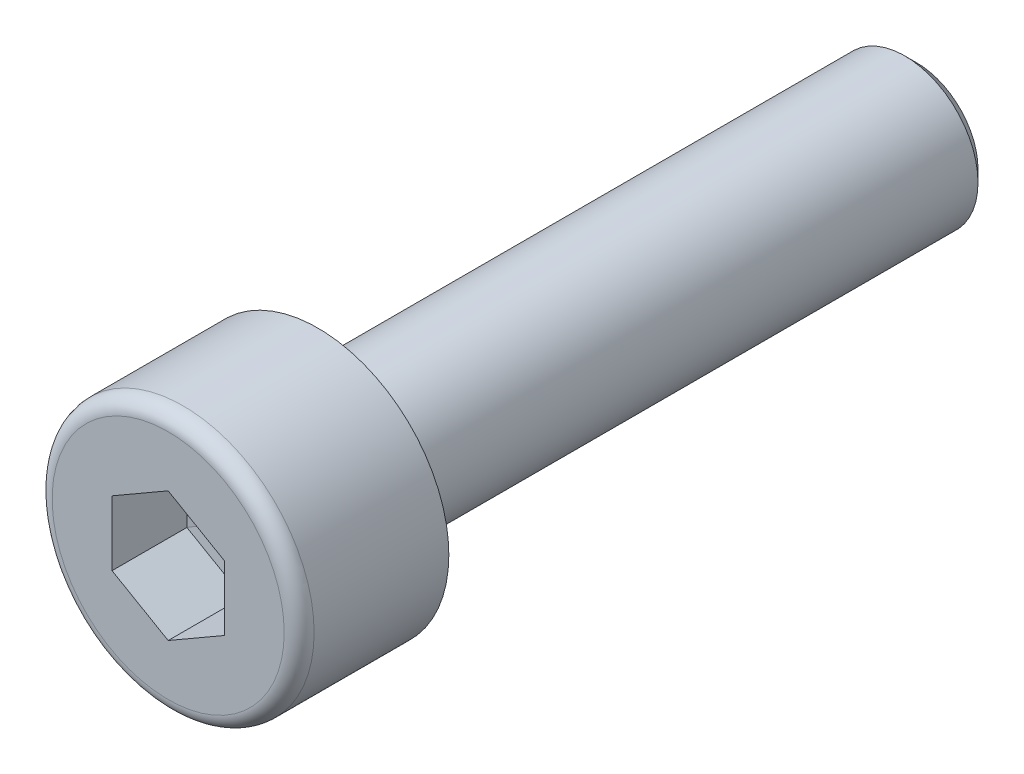
ISO-10303-21;
HEADER;
FILE_DESCRIPTION(('STEP AP214'),'2;1');
FILE_NAME('part.step','',(''),(''),'','','');
FILE_SCHEMA(('AUTOMOTIVE_DESIGN { 1 0 10303 214 1 1 1 1 }'));
ENDSEC;
DATA;
#1=APPLICATION_CONTEXT('core data for automotive mechanical design processes');
#2=APPLICATION_PROTOCOL_DEFINITION('international standard','automotive_design',2000,#1);
#3=PRODUCT_CONTEXT('',#1,'mechanical');
#4=PRODUCT('Part','Part','',(#3));
#5=PRODUCT_RELATED_PRODUCT_CATEGORY('part','',(#4));
#6=PRODUCT_DEFINITION_FORMATION('','',#4);
#7=PRODUCT_DEFINITION_CONTEXT('part definition',#1,'design');
#8=PRODUCT_DEFINITION('design','',#6,#7);
#9=PRODUCT_DEFINITION_SHAPE('','',#8);
#10=(LENGTH_UNIT() NAMED_UNIT(*) SI_UNIT(.MILLI.,.METRE.));
#11=(NAMED_UNIT(*) PLANE_ANGLE_UNIT() SI_UNIT($,.RADIAN.));
#12=(NAMED_UNIT(*) SI_UNIT($,.STERADIAN.) SOLID_ANGLE_UNIT());
#13=UNCERTAINTY_MEASURE_WITH_UNIT(LENGTH_MEASURE(1.E-05),#10,'distance_accuracy_value','');
#14=(GEOMETRIC_REPRESENTATION_CONTEXT(3) GLOBAL_UNCERTAINTY_ASSIGNED_CONTEXT((#13)) GLOBAL_UNIT_ASSIGNED_CONTEXT((#10,
#11,#12)) REPRESENTATION_CONTEXT('',''));
#15=CARTESIAN_POINT('',(0.,0.,0.));
#16=DIRECTION('',(0.,0.,1.));
#17=DIRECTION('',(1.,0.,0.));
#18=AXIS2_PLACEMENT_3D('',#15,#16,#17);
#19=CARTESIAN_POINT('',(-2.,0.,-5.52772388523122E-13));
#20=DIRECTION('',(0.,0.,-1.));
#21=DIRECTION('',(0.,-1.,0.));
#22=AXIS2_PLACEMENT_3D('',#19,#20,#21);
#23=PLANE('',#22);
#24=CARTESIAN_POINT('',(0.,0.,-5.48450174164827E-13));
#25=DIRECTION('',(0.,0.,-1.));
#26=DIRECTION('',(-1.,0.,0.));
#27=AXIS2_PLACEMENT_3D('',#24,#25,#26);
#28=CIRCLE('',#27,1.954);
#29=CARTESIAN_POINT('',(1.954,0.,-5.4354118545641E-13));
#30=VERTEX_POINT('',#29);
#31=EDGE_CURVE('E11',#30,#30,#28,.T.);
#32=ORIENTED_EDGE('',*,*,#31,.F.);
#33=EDGE_LOOP('',(#32));
#34=FACE_BOUND('',#33,.T.);
#35=CARTESIAN_POINT('',(0.,0.,-9.59435996912573E-13));
#36=DIRECTION('',(0.,0.,-1.));
#37=DIRECTION('',(1.,0.,0.));
#38=AXIS2_PLACEMENT_3D('',#35,#36,#37);
#39=CIRCLE('',#38,3.5);
#40=CARTESIAN_POINT('',(3.5,0.,-9.51183576347603E-13));
#41=VERTEX_POINT('',#40);
#42=EDGE_CURVE('E169',#41,#41,#39,.T.);
#43=ORIENTED_EDGE('',*,*,#42,.T.);
#44=EDGE_LOOP('',(#43));
#45=FACE_BOUND('',#44,.T.);
#46=ADVANCED_FACE('F17',(#34,#45),#23,.T.);
#47=CARTESIAN_POINT('',(0.,0.,-16.));
#48=DIRECTION('',(0.,0.,-1.));
#49=DIRECTION('',(0.,-1.,0.));
#50=AXIS2_PLACEMENT_3D('',#47,#48,#49);
#51=PLANE('',#50);
#52=CARTESIAN_POINT('',(0.,0.,-16.));
#53=DIRECTION('',(0.,0.,-1.));
#54=DIRECTION('',(-1.,0.,0.));
#55=AXIS2_PLACEMENT_3D('',#52,#53,#54);
#56=CIRCLE('',#55,1.640000000004);
#57=CARTESIAN_POINT('',(1.640000000004,0.,-16.));
#58=VERTEX_POINT('',#57);
#59=EDGE_CURVE('E293',#58,#58,#56,.T.);
#60=ORIENTED_EDGE('',*,*,#59,.T.);
#61=EDGE_LOOP('',(#60));
#62=FACE_BOUND('',#61,.T.);
#63=ADVANCED_FACE('F276',(#62),#51,.T.);
#64=CARTESIAN_POINT('',(0.,0.,-8.00000000000027));
#65=DIRECTION('',(0.,0.,-1.));
#66=DIRECTION('',(-1.,0.,0.));
#67=AXIS2_PLACEMENT_3D('',#64,#65,#66);
#68=CYLINDRICAL_SURFACE('',#67,1.954);
#69=CARTESIAN_POINT('',(0.,0.,-15.6860000000043));
#70=DIRECTION('',(0.,0.,1.));
#71=DIRECTION('',(-1.,0.,0.));
#72=AXIS2_PLACEMENT_3D('',#69,#70,#71);
#73=CIRCLE('',#72,1.954);
#74=CARTESIAN_POINT('',(1.95400000000004,0.,-15.6860000000043));
#75=VERTEX_POINT('',#74);
#76=EDGE_CURVE('E303',#75,#75,#73,.T.);
#77=ORIENTED_EDGE('',*,*,#76,.T.);
#78=DIRECTION('',(0.,0.,1.));
#79=VECTOR('',#78,1.);
#80=CARTESIAN_POINT('',(1.954,0.,-8.00000000000027));
#81=LINE('',#80,#79);
#82=EDGE_CURVE('E20',#75,#30,#81,.T.);
#83=ORIENTED_EDGE('',*,*,#82,.T.);
#84=ORIENTED_EDGE('',*,*,#31,.T.);
#85=ORIENTED_EDGE('',*,*,#82,.F.);
#86=EDGE_LOOP('',(#77,#83,#84,#85));
#87=FACE_BOUND('',#86,.T.);
#88=ADVANCED_FACE('F282',(#87),#68,.T.);
#89=CARTESIAN_POINT('',(-1.5,-0.866025403784439,4.));
#90=DIRECTION('',(-1.,0.,0.));
#91=DIRECTION('',(0.,0.,1.));
#92=AXIS2_PLACEMENT_3D('',#89,#90,#91);
#93=PLANE('',#92);
#94=DIRECTION('',(0.,1.,0.));
#95=VECTOR('',#94,1.);
#96=CARTESIAN_POINT('',(-1.5,-0.433012701892219,3.99999999999963));
#97=LINE('',#96,#95);
#98=CARTESIAN_POINT('',(-1.5,-0.866025403784439,4.));
#99=VERTEX_POINT('',#98);
#100=CARTESIAN_POINT('',(-1.5,0.866025403784438,4.));
#101=VERTEX_POINT('',#100);
#102=EDGE_CURVE('E137',#99,#101,#97,.T.);
#103=ORIENTED_EDGE('',*,*,#102,.F.);
#104=DIRECTION('',(0.,0.,-1.));
#105=VECTOR('',#104,1.);
#106=CARTESIAN_POINT('',(-1.5,-0.866025403784439,4.));
#107=LINE('',#106,#105);
#108=CARTESIAN_POINT('',(-1.5,-0.866025403784439,2.));
#109=VERTEX_POINT('',#108);
#110=EDGE_CURVE('E128',#99,#109,#107,.T.);
#111=ORIENTED_EDGE('',*,*,#110,.T.);
#112=DIRECTION('',(0.,1.,0.));
#113=VECTOR('',#112,1.);
#114=CARTESIAN_POINT('',(-1.5,-0.866025403784439,2.));
#115=LINE('',#114,#113);
#116=CARTESIAN_POINT('',(-1.5,0.866025403784438,2.));
#117=VERTEX_POINT('',#116);
#118=EDGE_CURVE('E223',#109,#117,#115,.T.);
#119=ORIENTED_EDGE('',*,*,#118,.T.);
#120=DIRECTION('',(0.,0.,-1.));
#121=VECTOR('',#120,1.);
#122=CARTESIAN_POINT('',(-1.5,0.866025403784438,4.));
#123=LINE('',#122,#121);
#124=EDGE_CURVE('E45',#101,#117,#123,.T.);
#125=ORIENTED_EDGE('',*,*,#124,.F.);
#126=EDGE_LOOP('',(#103,#111,#119,#125));
#127=FACE_BOUND('',#126,.T.);
#128=ADVANCED_FACE('F252',(#127),#93,.F.);
#129=CARTESIAN_POINT('',(0.,-1.73205080756888,4.));
#130=DIRECTION('',(-0.5,-0.866025403784439,0.));
#131=DIRECTION('',(-0.866025403784439,0.5,0.));
#132=AXIS2_PLACEMENT_3D('',#129,#130,#131);
#133=PLANE('',#132);
#134=DIRECTION('',(-0.866025403784439,0.5,0.));
#135=VECTOR('',#134,1.);
#136=CARTESIAN_POINT('',(-1.6875,-0.757772228311384,3.99999999999963));
#137=LINE('',#136,#135);
#138=CARTESIAN_POINT('',(0.,-1.73205080756888,4.));
#139=VERTEX_POINT('',#138);
#140=EDGE_CURVE('E131',#139,#99,#137,.T.);
#141=ORIENTED_EDGE('',*,*,#140,.F.);
#142=DIRECTION('',(0.,0.,-1.));
#143=VECTOR('',#142,1.);
#144=CARTESIAN_POINT('',(0.,-1.73205080756888,4.));
#145=LINE('',#144,#143);
#146=CARTESIAN_POINT('',(0.,-1.73205080756888,2.));
#147=VERTEX_POINT('',#146);
#148=EDGE_CURVE('E116',#139,#147,#145,.T.);
#149=ORIENTED_EDGE('',*,*,#148,.T.);
#150=DIRECTION('',(-0.866025403784439,0.5,0.));
#151=VECTOR('',#150,1.);
#152=CARTESIAN_POINT('',(0.,-1.73205080756888,2.));
#153=LINE('',#152,#151);
#154=EDGE_CURVE('E182',#147,#109,#153,.T.);
#155=ORIENTED_EDGE('',*,*,#154,.T.);
#156=ORIENTED_EDGE('',*,*,#110,.F.);
#157=EDGE_LOOP('',(#141,#149,#155,#156));
#158=FACE_BOUND('',#157,.T.);
#159=ADVANCED_FACE('F132',(#158),#133,.F.);
#160=CARTESIAN_POINT('',(1.5,-0.866025403784439,4.));
#161=DIRECTION('',(0.5,-0.866025403784439,0.));
#162=DIRECTION('',(0.,0.,-1.));
#163=AXIS2_PLACEMENT_3D('',#160,#161,#162);
#164=PLANE('',#163);
#165=DIRECTION('',(-0.866025403784439,-0.5,0.));
#166=VECTOR('',#165,1.);
#167=CARTESIAN_POINT('',(-0.1875,-1.84030398304193,3.99999999999964));
#168=LINE('',#167,#166);
#169=CARTESIAN_POINT('',(1.5,-0.866025403784439,4.));
#170=VERTEX_POINT('',#169);
#171=EDGE_CURVE('E120',#170,#139,#168,.T.);
#172=ORIENTED_EDGE('',*,*,#171,.F.);
#173=DIRECTION('',(0.,0.,-1.));
#174=VECTOR('',#173,1.);
#175=CARTESIAN_POINT('',(1.5,-0.866025403784439,4.));
#176=LINE('',#175,#174);
#177=CARTESIAN_POINT('',(1.5,-0.866025403784439,2.));
#178=VERTEX_POINT('',#177);
#179=EDGE_CURVE('E129',#170,#178,#176,.T.);
#180=ORIENTED_EDGE('',*,*,#179,.T.);
#181=DIRECTION('',(-0.866025403784439,-0.5,0.));
#182=VECTOR('',#181,1.);
#183=CARTESIAN_POINT('',(1.5,-0.866025403784439,2.));
#184=LINE('',#183,#182);
#185=EDGE_CURVE('E123',#178,#147,#184,.T.);
#186=ORIENTED_EDGE('',*,*,#185,.T.);
#187=ORIENTED_EDGE('',*,*,#148,.F.);
#188=EDGE_LOOP('',(#172,#180,#186,#187));
#189=FACE_BOUND('',#188,.T.);
#190=ADVANCED_FACE('F118',(#189),#164,.F.);
#191=CARTESIAN_POINT('',(1.5,0.866025403784439,4.));
#192=DIRECTION('',(1.,0.,0.));
#193=DIRECTION('',(0.,-1.,0.));
#194=AXIS2_PLACEMENT_3D('',#191,#192,#193);
#195=PLANE('',#194);
#196=DIRECTION('',(0.,-1.,0.));
#197=VECTOR('',#196,1.);
#198=CARTESIAN_POINT('',(1.5,0.433012701892219,3.99999999999964));
#199=LINE('',#198,#197);
#200=CARTESIAN_POINT('',(1.5,0.866025403784439,4.));
#201=VERTEX_POINT('',#200);
#202=EDGE_CURVE('E144',#201,#170,#199,.T.);
#203=ORIENTED_EDGE('',*,*,#202,.F.);
#204=DIRECTION('',(0.,0.,-1.));
#205=VECTOR('',#204,1.);
#206=CARTESIAN_POINT('',(1.5,0.866025403784439,4.));
#207=LINE('',#206,#205);
#208=CARTESIAN_POINT('',(1.5,0.866025403784439,2.));
#209=VERTEX_POINT('',#208);
#210=EDGE_CURVE('E200',#201,#209,#207,.T.);
#211=ORIENTED_EDGE('',*,*,#210,.T.);
#212=DIRECTION('',(0.,-1.,0.));
#213=VECTOR('',#212,1.);
#214=CARTESIAN_POINT('',(1.5,0.866025403784439,2.));
#215=LINE('',#214,#213);
#216=EDGE_CURVE('E195',#209,#178,#215,.T.);
#217=ORIENTED_EDGE('',*,*,#216,.T.);
#218=ORIENTED_EDGE('',*,*,#179,.F.);
#219=EDGE_LOOP('',(#203,#211,#217,#218));
#220=FACE_BOUND('',#219,.T.);
#221=ADVANCED_FACE('F236',(#220),#195,.F.);
#222=CARTESIAN_POINT('',(0.,1.73205080756888,4.));
#223=DIRECTION('',(0.5,0.866025403784439,0.));
#224=DIRECTION('',(0.,0.,-1.));
#225=AXIS2_PLACEMENT_3D('',#222,#223,#224);
#226=PLANE('',#225);
#227=DIRECTION('',(0.866025403784439,-0.5,0.));
#228=VECTOR('',#227,1.);
#229=CARTESIAN_POINT('',(-0.9375,2.27331668493415,3.99999999999963));
#230=LINE('',#229,#228);
#231=CARTESIAN_POINT('',(0.,1.73205080756888,4.));
#232=VERTEX_POINT('',#231);
#233=EDGE_CURVE('E151',#232,#201,#230,.T.);
#234=ORIENTED_EDGE('',*,*,#233,.F.);
#235=DIRECTION('',(0.,0.,-1.));
#236=VECTOR('',#235,1.);
#237=CARTESIAN_POINT('',(0.,1.73205080756888,4.));
#238=LINE('',#237,#236);
#239=CARTESIAN_POINT('',(0.,1.73205080756888,2.));
#240=VERTEX_POINT('',#239);
#241=EDGE_CURVE('E203',#232,#240,#238,.T.);
#242=ORIENTED_EDGE('',*,*,#241,.T.);
#243=DIRECTION('',(0.866025403784439,-0.5,0.));
#244=VECTOR('',#243,1.);
#245=CARTESIAN_POINT('',(0.,1.73205080756888,2.));
#246=LINE('',#245,#244);
#247=EDGE_CURVE('E207',#240,#209,#246,.T.);
#248=ORIENTED_EDGE('',*,*,#247,.T.);
#249=ORIENTED_EDGE('',*,*,#210,.F.);
#250=EDGE_LOOP('',(#234,#242,#248,#249));
#251=FACE_BOUND('',#250,.T.);
#252=ADVANCED_FACE('F257',(#251),#226,.F.);
#253=CARTESIAN_POINT('',(-1.5,0.86602540378444,4.));
#254=DIRECTION('',(-0.5,0.866025403784439,0.));
#255=DIRECTION('',(0.,0.,1.));
#256=AXIS2_PLACEMENT_3D('',#253,#254,#255);
#257=PLANE('',#256);
#258=DIRECTION('',(0.866025403784439,0.5,0.));
#259=VECTOR('',#258,1.);
#260=CARTESIAN_POINT('',(-2.4375,0.324759526419167,3.99999999999963));
#261=LINE('',#260,#259);
#262=EDGE_CURVE('E164',#101,#232,#261,.T.);
#263=ORIENTED_EDGE('',*,*,#262,.F.);
#264=ORIENTED_EDGE('',*,*,#124,.T.);
#265=DIRECTION('',(0.866025403784439,0.5,0.));
#266=VECTOR('',#265,1.);
#267=CARTESIAN_POINT('',(-1.5,0.86602540378444,2.));
#268=LINE('',#267,#266);
#269=EDGE_CURVE('E215',#117,#240,#268,.T.);
#270=ORIENTED_EDGE('',*,*,#269,.T.);
#271=ORIENTED_EDGE('',*,*,#241,.F.);
#272=EDGE_LOOP('',(#263,#264,#270,#271));
#273=FACE_BOUND('',#272,.T.);
#274=ADVANCED_FACE('F253',(#273),#257,.F.);
#275=CARTESIAN_POINT('',(-1.5,0.866025403784438,2.));
#276=DIRECTION('',(-0.0871557427476581,0.,-0.996194698091746));
#277=DIRECTION('',(-0.996194698091746,0.,0.0871557427476581));
#278=AXIS2_PLACEMENT_3D('',#275,#276,#277);
#279=PLANE('',#278);
#280=DIRECTION('',(0.863550259614423,-0.498570974847159,-0.0755508581011305));
#281=VECTOR('',#280,1.);
#282=CARTESIAN_POINT('',(-1.12714047455993,0.6507548564017,1.96737901843634));
#283=LINE('',#282,#281);
#284=CARTESIAN_POINT('',(0.,0.,1.86876700471111));
#285=VERTEX_POINT('',#284);
#286=EDGE_CURVE('E220',#117,#285,#283,.T.);
#287=ORIENTED_EDGE('',*,*,#286,.F.);
#288=ORIENTED_EDGE('',*,*,#118,.F.);
#289=DIRECTION('',(0.863550259614423,0.498570974847158,-0.0755508581011305));
#290=VECTOR('',#289,1.);
#291=CARTESIAN_POINT('',(-1.12714047455993,-0.6507548564017,1.96737901843634));
#292=LINE('',#291,#290);
#293=EDGE_CURVE('E178',#109,#285,#292,.T.);
#294=ORIENTED_EDGE('',*,*,#293,.T.);
#295=EDGE_LOOP('',(#287,#288,#294));
#296=FACE_BOUND('',#295,.T.);
#297=ADVANCED_FACE('F249',(#296),#279,.F.);
#298=CARTESIAN_POINT('',(0.,1.73205080756888,2.));
#299=DIRECTION('',(-0.043577871373829,0.0754790873051733,-0.996194698091746));
#300=DIRECTION('',(-0.999044587684655,0.,0.043702537889669));
#301=AXIS2_PLACEMENT_3D('',#298,#299,#300);
#302=PLANE('',#301);
#303=DIRECTION('',(0.,-0.997141949694317,-0.0755508581011306));
#304=VECTOR('',#303,1.);
#305=CARTESIAN_POINT('',(0.,1.3015097128034,1.96737901843634));
#306=LINE('',#305,#304);
#307=EDGE_CURVE('E211',#240,#285,#306,.T.);
#308=ORIENTED_EDGE('',*,*,#307,.F.);
#309=ORIENTED_EDGE('',*,*,#269,.F.);
#310=ORIENTED_EDGE('',*,*,#286,.T.);
#311=EDGE_LOOP('',(#308,#309,#310));
#312=FACE_BOUND('',#311,.T.);
#313=ADVANCED_FACE('F262',(#312),#302,.F.);
#314=CARTESIAN_POINT('',(1.5,0.866025403784439,2.));
#315=DIRECTION('',(0.0435778713738291,0.0754790873051733,-0.996194698091746));
#316=DIRECTION('',(-0.999044587684655,0.,-0.0437025378896691));
#317=AXIS2_PLACEMENT_3D('',#314,#315,#316);
#318=PLANE('',#317);
#319=DIRECTION('',(-0.863550259614423,-0.498570974847158,-0.0755508581011305));
#320=VECTOR('',#319,1.);
#321=CARTESIAN_POINT('',(1.12714047455993,0.650754856401705,1.96737901843634));
#322=LINE('',#321,#320);
#323=EDGE_CURVE('E199',#209,#285,#322,.T.);
#324=ORIENTED_EDGE('',*,*,#323,.F.);
#325=ORIENTED_EDGE('',*,*,#247,.F.);
#326=ORIENTED_EDGE('',*,*,#307,.T.);
#327=EDGE_LOOP('',(#324,#325,#326));
#328=FACE_BOUND('',#327,.T.);
#329=ADVANCED_FACE('F260',(#328),#318,.F.);
#330=CARTESIAN_POINT('',(1.5,-0.866025403784439,2.));
#331=DIRECTION('',(0.0871557427476581,0.,-0.996194698091746));
#332=DIRECTION('',(0.,-1.,0.));
#333=AXIS2_PLACEMENT_3D('',#330,#331,#332);
#334=PLANE('',#333);
#335=DIRECTION('',(-0.863550259614423,0.498570974847158,-0.0755508581011305));
#336=VECTOR('',#335,1.);
#337=CARTESIAN_POINT('',(1.12714047455993,-0.650754856401705,1.96737901843634));
#338=LINE('',#337,#336);
#339=EDGE_CURVE('E191',#178,#285,#338,.T.);
#340=ORIENTED_EDGE('',*,*,#339,.F.);
#341=ORIENTED_EDGE('',*,*,#216,.F.);
#342=ORIENTED_EDGE('',*,*,#323,.T.);
#343=EDGE_LOOP('',(#340,#341,#342));
#344=FACE_BOUND('',#343,.T.);
#345=ADVANCED_FACE('F238',(#344),#334,.F.);
#346=CARTESIAN_POINT('',(0.,-1.73205080756888,2.));
#347=DIRECTION('',(0.043577871373829,-0.0754790873051733,-0.996194698091746));
#348=DIRECTION('',(0.,-0.997141949694317,0.0755508581011305));
#349=AXIS2_PLACEMENT_3D('',#346,#347,#348);
#350=PLANE('',#349);
#351=DIRECTION('',(0.,0.997141949694317,-0.0755508581011306));
#352=VECTOR('',#351,1.);
#353=CARTESIAN_POINT('',(0.,-1.3015097128034,1.96737901843634));
#354=LINE('',#353,#352);
#355=EDGE_CURVE('E185',#147,#285,#354,.T.);
#356=ORIENTED_EDGE('',*,*,#355,.F.);
#357=ORIENTED_EDGE('',*,*,#185,.F.);
#358=ORIENTED_EDGE('',*,*,#339,.T.);
#359=EDGE_LOOP('',(#356,#357,#358));
#360=FACE_BOUND('',#359,.T.);
#361=ADVANCED_FACE('F241',(#360),#350,.F.);
#362=CARTESIAN_POINT('',(-1.5,-0.866025403784439,2.));
#363=DIRECTION('',(-0.0435778713738291,-0.0754790873051733,-0.996194698091746));
#364=DIRECTION('',(0.,-0.997141949694317,0.0755508581011305));
#365=AXIS2_PLACEMENT_3D('',#362,#363,#364);
#366=PLANE('',#365);
#367=ORIENTED_EDGE('',*,*,#293,.F.);
#368=ORIENTED_EDGE('',*,*,#154,.F.);
#369=ORIENTED_EDGE('',*,*,#355,.T.);
#370=EDGE_LOOP('',(#367,#368,#369));
#371=FACE_BOUND('',#370,.T.);
#372=ADVANCED_FACE('F245',(#371),#366,.F.);
#373=CARTESIAN_POINT('',(0.,0.,1.99999999999934));
#374=DIRECTION('',(0.,0.,-1.));
#375=DIRECTION('',(-1.,0.,0.));
#376=AXIS2_PLACEMENT_3D('',#373,#374,#375);
#377=CYLINDRICAL_SURFACE('',#376,3.5);
#378=ORIENTED_EDGE('',*,*,#42,.F.);
#379=DIRECTION('',(0.,0.,1.));
#380=VECTOR('',#379,1.);
#381=CARTESIAN_POINT('',(3.5,0.,1.99999999999935));
#382=LINE('',#381,#380);
#383=CARTESIAN_POINT('',(3.5,0.,3.59999999999964));
#384=VERTEX_POINT('',#383);
#385=EDGE_CURVE('E175',#41,#384,#382,.T.);
#386=ORIENTED_EDGE('',*,*,#385,.T.);
#387=CARTESIAN_POINT('',(0.,0.,3.59999999999964));
#388=DIRECTION('',(0.,0.,1.));
#389=DIRECTION('',(1.,0.,0.));
#390=AXIS2_PLACEMENT_3D('',#387,#388,#389);
#391=CIRCLE('',#390,3.5);
#392=EDGE_CURVE('E155',#384,#384,#391,.T.);
#393=ORIENTED_EDGE('',*,*,#392,.F.);
#394=ORIENTED_EDGE('',*,*,#385,.F.);
#395=EDGE_LOOP('',(#378,#386,#393,#394));
#396=FACE_BOUND('',#395,.T.);
#397=ADVANCED_FACE('F287',(#396),#377,.T.);
#398=CARTESIAN_POINT('',(-3.5,0.,3.99999999999963));
#399=DIRECTION('',(0.,0.,1.));
#400=DIRECTION('',(1.,0.,0.));
#401=AXIS2_PLACEMENT_3D('',#398,#399,#400);
#402=PLANE('',#401);
#403=ORIENTED_EDGE('',*,*,#262,.T.);
#404=ORIENTED_EDGE('',*,*,#233,.T.);
#405=ORIENTED_EDGE('',*,*,#202,.T.);
#406=ORIENTED_EDGE('',*,*,#171,.T.);
#407=ORIENTED_EDGE('',*,*,#140,.T.);
#408=ORIENTED_EDGE('',*,*,#102,.T.);
#409=EDGE_LOOP('',(#403,#404,#405,#406,#407,#408));
#410=FACE_BOUND('',#409,.T.);
#411=CARTESIAN_POINT('',(0.,0.,3.99999999999964));
#412=DIRECTION('',(0.,0.,-1.));
#413=DIRECTION('',(1.,0.,0.));
#414=AXIS2_PLACEMENT_3D('',#411,#412,#413);
#415=CIRCLE('',#414,3.1);
#416=CARTESIAN_POINT('',(3.1,0.,3.99999999999964));
#417=VERTEX_POINT('',#416);
#418=EDGE_CURVE('E160',#417,#417,#415,.T.);
#419=ORIENTED_EDGE('',*,*,#418,.F.);
#420=EDGE_LOOP('',(#419));
#421=FACE_BOUND('',#420,.T.);
#422=ADVANCED_FACE('F140',(#410,#421),#402,.T.);
#423=CARTESIAN_POINT('',(0.,0.,3.59999999999964));
#424=DIRECTION('',(0.,0.,-1.));
#425=DIRECTION('',(-1.,0.,0.));
#426=AXIS2_PLACEMENT_3D('',#423,#424,#425);
#427=TOROIDAL_SURFACE('',#426,3.1,0.4);
#428=ORIENTED_EDGE('',*,*,#392,.T.);
#429=CARTESIAN_POINT('',(3.1,0.,3.59999999999964));
#430=DIRECTION('',(0.,-1.,0.));
#431=DIRECTION('',(1.,0.,0.));
#432=AXIS2_PLACEMENT_3D('',#429,#430,#431);
#433=CIRCLE('',#432,0.4);
#434=EDGE_CURVE('E157',#384,#417,#433,.T.);
#435=ORIENTED_EDGE('',*,*,#434,.T.);
#436=ORIENTED_EDGE('',*,*,#418,.T.);
#437=ORIENTED_EDGE('',*,*,#434,.F.);
#438=EDGE_LOOP('',(#428,#435,#436,#437));
#439=FACE_BOUND('',#438,.T.);
#440=ADVANCED_FACE('F315',(#439),#427,.T.);
#441=CARTESIAN_POINT('',(0.,0.,-15.8));
#442=DIRECTION('',(0.,0.,1.));
#443=DIRECTION('',(-1.,0.,0.));
#444=AXIS2_PLACEMENT_3D('',#441,#442,#443);
#445=CONICAL_SURFACE('',#444,1.8400000000042,0.785398163397954);
#446=ORIENTED_EDGE('',*,*,#76,.F.);
#447=DIRECTION('',(-0.707106781186905,0.,-0.70710678118619));
#448=VECTOR('',#447,1.);
#449=CARTESIAN_POINT('',(1.8400000000042,0.,-15.8));
#450=LINE('',#449,#448);
#451=EDGE_CURVE('E297',#75,#58,#450,.T.);
#452=ORIENTED_EDGE('',*,*,#451,.T.);
#453=ORIENTED_EDGE('',*,*,#59,.F.);
#454=ORIENTED_EDGE('',*,*,#451,.F.);
#455=EDGE_LOOP('',(#446,#452,#453,#454));
#456=FACE_BOUND('',#455,.T.);
#457=ADVANCED_FACE('F313',(#456),#445,.T.);
#458=CLOSED_SHELL('',(#46,#63,#88,#128,#159,#190,#221,#252,#274,#297,#313,#329,#345,#361,#372,
#397,#422,#440,#457));
#459=MANIFOLD_SOLID_BREP('B1',#458);
#460=ADVANCED_BREP_SHAPE_REPRESENTATION('',(#18,#459),#14);
#461=SHAPE_DEFINITION_REPRESENTATION(#9,#460);
ENDSEC;
END-ISO-10303-21;
